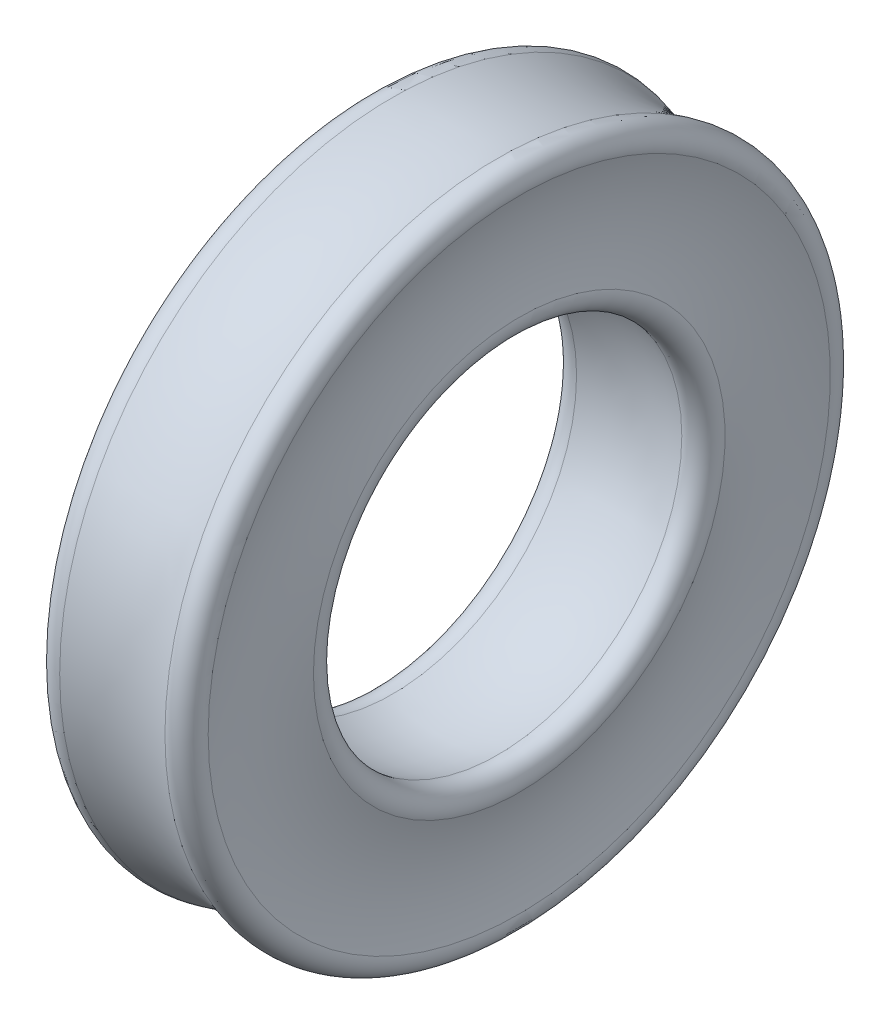
ISO-10303-21;
HEADER;
FILE_DESCRIPTION(('STEP AP214'),'2;1');
FILE_NAME('part.step','',(''),(''),'','','');
FILE_SCHEMA(('AUTOMOTIVE_DESIGN { 1 0 10303 214 1 1 1 1 }'));
ENDSEC;
DATA;
#1=APPLICATION_CONTEXT('core data for automotive mechanical design processes');
#2=APPLICATION_PROTOCOL_DEFINITION('international standard','automotive_design',2000,#1);
#3=PRODUCT_CONTEXT('',#1,'mechanical');
#4=PRODUCT('Part','Part','',(#3));
#5=PRODUCT_RELATED_PRODUCT_CATEGORY('part','',(#4));
#6=PRODUCT_DEFINITION_FORMATION('','',#4);
#7=PRODUCT_DEFINITION_CONTEXT('part definition',#1,'design');
#8=PRODUCT_DEFINITION('design','',#6,#7);
#9=PRODUCT_DEFINITION_SHAPE('','',#8);
#10=(LENGTH_UNIT() NAMED_UNIT(*) SI_UNIT(.MILLI.,.METRE.));
#11=(NAMED_UNIT(*) PLANE_ANGLE_UNIT() SI_UNIT($,.RADIAN.));
#12=(NAMED_UNIT(*) SI_UNIT($,.STERADIAN.) SOLID_ANGLE_UNIT());
#13=UNCERTAINTY_MEASURE_WITH_UNIT(LENGTH_MEASURE(1.E-05),#10,'distance_accuracy_value','');
#14=(GEOMETRIC_REPRESENTATION_CONTEXT(3) GLOBAL_UNCERTAINTY_ASSIGNED_CONTEXT((#13)) GLOBAL_UNIT_ASSIGNED_CONTEXT((#10,
#11,#12)) REPRESENTATION_CONTEXT('',''));
#15=CARTESIAN_POINT('',(0.,0.,0.));
#16=DIRECTION('',(0.,0.,1.));
#17=DIRECTION('',(1.,0.,0.));
#18=AXIS2_PLACEMENT_3D('',#15,#16,#17);
#19=CARTESIAN_POINT('',(4.15163969926534,0.,0.));
#20=DIRECTION('',(-1.,0.,0.));
#21=DIRECTION('',(0.,0.,1.));
#22=AXIS2_PLACEMENT_3D('',#19,#20,#21);
#23=TOROIDAL_SURFACE('',#22,4.51,3.);
#24=CARTESIAN_POINT('',(1.29560360902412,0.,0.));
#25=DIRECTION('',(-1.,0.,0.));
#26=DIRECTION('',(0.,0.,1.));
#27=AXIS2_PLACEMENT_3D('',#24,#25,#26);
#28=CIRCLE('',#27,5.42818181818182);
#29=CARTESIAN_POINT('',(1.29560360902412,0.,5.42818181818182));
#30=VERTEX_POINT('',#29);
#31=EDGE_CURVE('E10',#30,#30,#28,.T.);
#32=ORIENTED_EDGE('',*,*,#31,.F.);
#33=EDGE_LOOP('',(#32));
#34=FACE_BOUND('',#33,.T.);
#35=CARTESIAN_POINT('',(1.29560360902412,0.,0.));
#36=DIRECTION('',(-1.,0.,0.));
#37=DIRECTION('',(0.,0.,1.));
#38=AXIS2_PLACEMENT_3D('',#35,#36,#37);
#39=CIRCLE('',#38,3.59181818181818);
#40=CARTESIAN_POINT('',(1.29560360902412,0.,3.59181818181818));
#41=VERTEX_POINT('',#40);
#42=EDGE_CURVE('E60',#41,#41,#39,.T.);
#43=ORIENTED_EDGE('',*,*,#42,.T.);
#44=EDGE_LOOP('',(#43));
#45=FACE_BOUND('',#44,.T.);
#46=ADVANCED_FACE('F32',(#34,#45),#23,.F.);
#47=CARTESIAN_POINT('',(1.01,0.,0.));
#48=DIRECTION('',(-1.,0.,0.));
#49=DIRECTION('',(0.,0.,1.));
#50=AXIS2_PLACEMENT_3D('',#47,#48,#49);
#51=TOROIDAL_SURFACE('',#50,5.52,0.3);
#52=CARTESIAN_POINT('',(0.918181818181818,0.,0.));
#53=DIRECTION('',(-1.,0.,0.));
#54=DIRECTION('',(0.,0.,1.));
#55=AXIS2_PLACEMENT_3D('',#52,#53,#54);
#56=CIRCLE('',#55,5.80560360902412);
#57=CARTESIAN_POINT('',(0.918181818181818,0.,5.80560360902412));
#58=VERTEX_POINT('',#57);
#59=EDGE_CURVE('E38',#58,#58,#56,.T.);
#60=ORIENTED_EDGE('',*,*,#59,.F.);
#61=EDGE_LOOP('',(#60));
#62=FACE_BOUND('',#61,.T.);
#63=ORIENTED_EDGE('',*,*,#31,.T.);
#64=EDGE_LOOP('',(#63));
#65=FACE_BOUND('',#64,.T.);
#66=ADVANCED_FACE('F97',(#62,#65),#51,.T.);
#67=CARTESIAN_POINT('',(0.,0.,0.));
#68=DIRECTION('',(-1.,0.,0.));
#69=DIRECTION('',(0.,0.,1.));
#70=AXIS2_PLACEMENT_3D('',#67,#68,#69);
#71=TOROIDAL_SURFACE('',#70,8.66163969926534,3.);
#72=CARTESIAN_POINT('',(-0.918181818181818,0.,0.));
#73=DIRECTION('',(-1.,0.,0.));
#74=DIRECTION('',(0.,0.,1.));
#75=AXIS2_PLACEMENT_3D('',#72,#73,#74);
#76=CIRCLE('',#75,5.80560360902412);
#77=CARTESIAN_POINT('',(-0.918181818181818,0.,5.80560360902412));
#78=VERTEX_POINT('',#77);
#79=EDGE_CURVE('E42',#78,#78,#76,.T.);
#80=ORIENTED_EDGE('',*,*,#79,.F.);
#81=EDGE_LOOP('',(#80));
#82=FACE_BOUND('',#81,.T.);
#83=ORIENTED_EDGE('',*,*,#59,.T.);
#84=EDGE_LOOP('',(#83));
#85=FACE_BOUND('',#84,.T.);
#86=ADVANCED_FACE('F92',(#82,#85),#71,.F.);
#87=CARTESIAN_POINT('',(-1.01,0.,0.));
#88=DIRECTION('',(-1.,0.,0.));
#89=DIRECTION('',(0.,0.,1.));
#90=AXIS2_PLACEMENT_3D('',#87,#88,#89);
#91=TOROIDAL_SURFACE('',#90,5.52,0.3);
#92=CARTESIAN_POINT('',(-1.29560360902412,0.,0.));
#93=DIRECTION('',(-1.,0.,0.));
#94=DIRECTION('',(0.,0.,1.));
#95=AXIS2_PLACEMENT_3D('',#92,#93,#94);
#96=CIRCLE('',#95,5.42818181818182);
#97=CARTESIAN_POINT('',(-1.29560360902412,0.,5.42818181818182));
#98=VERTEX_POINT('',#97);
#99=EDGE_CURVE('E46',#98,#98,#96,.T.);
#100=ORIENTED_EDGE('',*,*,#99,.F.);
#101=EDGE_LOOP('',(#100));
#102=FACE_BOUND('',#101,.T.);
#103=ORIENTED_EDGE('',*,*,#79,.T.);
#104=EDGE_LOOP('',(#103));
#105=FACE_BOUND('',#104,.T.);
#106=ADVANCED_FACE('F86',(#102,#105),#91,.T.);
#107=CARTESIAN_POINT('',(-4.15163969926534,0.,0.));
#108=DIRECTION('',(-1.,0.,0.));
#109=DIRECTION('',(0.,0.,1.));
#110=AXIS2_PLACEMENT_3D('',#107,#108,#109);
#111=TOROIDAL_SURFACE('',#110,4.51,3.);
#112=CARTESIAN_POINT('',(-1.29560360902412,0.,0.));
#113=DIRECTION('',(-1.,0.,0.));
#114=DIRECTION('',(0.,0.,1.));
#115=AXIS2_PLACEMENT_3D('',#112,#113,#114);
#116=CIRCLE('',#115,3.59181818181818);
#117=CARTESIAN_POINT('',(-1.29560360902412,0.,3.59181818181818));
#118=VERTEX_POINT('',#117);
#119=EDGE_CURVE('E51',#118,#118,#116,.T.);
#120=ORIENTED_EDGE('',*,*,#119,.F.);
#121=EDGE_LOOP('',(#120));
#122=FACE_BOUND('',#121,.T.);
#123=ORIENTED_EDGE('',*,*,#99,.T.);
#124=EDGE_LOOP('',(#123));
#125=FACE_BOUND('',#124,.T.);
#126=ADVANCED_FACE('F80',(#122,#125),#111,.F.);
#127=CARTESIAN_POINT('',(-1.01,0.,0.));
#128=DIRECTION('',(-1.,0.,0.));
#129=DIRECTION('',(0.,0.,1.));
#130=AXIS2_PLACEMENT_3D('',#127,#128,#129);
#131=TOROIDAL_SURFACE('',#130,3.5,0.3);
#132=CARTESIAN_POINT('',(-0.918181818181818,0.,0.));
#133=DIRECTION('',(-1.,0.,0.));
#134=DIRECTION('',(0.,0.,1.));
#135=AXIS2_PLACEMENT_3D('',#132,#133,#134);
#136=CIRCLE('',#135,3.21439639097588);
#137=CARTESIAN_POINT('',(-0.918181818181818,0.,3.21439639097588));
#138=VERTEX_POINT('',#137);
#139=EDGE_CURVE('E54',#138,#138,#136,.T.);
#140=ORIENTED_EDGE('',*,*,#139,.F.);
#141=EDGE_LOOP('',(#140));
#142=FACE_BOUND('',#141,.T.);
#143=ORIENTED_EDGE('',*,*,#119,.T.);
#144=EDGE_LOOP('',(#143));
#145=FACE_BOUND('',#144,.T.);
#146=ADVANCED_FACE('F74',(#142,#145),#131,.T.);
#147=CARTESIAN_POINT('',(0.,0.,0.));
#148=DIRECTION('',(-1.,0.,0.));
#149=DIRECTION('',(0.,0.,1.));
#150=AXIS2_PLACEMENT_3D('',#147,#148,#149);
#151=DEGENERATE_TOROIDAL_SURFACE('',#150,0.358360300734661,3.,.T.);
#152=CARTESIAN_POINT('',(0.918181818181817,0.,0.));
#153=DIRECTION('',(-1.,0.,0.));
#154=DIRECTION('',(0.,0.,1.));
#155=AXIS2_PLACEMENT_3D('',#152,#153,#154);
#156=CIRCLE('',#155,3.21439639097588);
#157=CARTESIAN_POINT('',(0.918181818181817,0.,3.21439639097588));
#158=VERTEX_POINT('',#157);
#159=EDGE_CURVE('E57',#158,#158,#156,.T.);
#160=ORIENTED_EDGE('',*,*,#159,.F.);
#161=EDGE_LOOP('',(#160));
#162=FACE_BOUND('',#161,.T.);
#163=ORIENTED_EDGE('',*,*,#139,.T.);
#164=EDGE_LOOP('',(#163));
#165=FACE_BOUND('',#164,.T.);
#166=ADVANCED_FACE('F68',(#162,#165),#151,.F.);
#167=CARTESIAN_POINT('',(1.01,0.,0.));
#168=DIRECTION('',(-1.,0.,0.));
#169=DIRECTION('',(0.,0.,1.));
#170=AXIS2_PLACEMENT_3D('',#167,#168,#169);
#171=TOROIDAL_SURFACE('',#170,3.5,0.3);
#172=ORIENTED_EDGE('',*,*,#42,.F.);
#173=EDGE_LOOP('',(#172));
#174=FACE_BOUND('',#173,.T.);
#175=ORIENTED_EDGE('',*,*,#159,.T.);
#176=EDGE_LOOP('',(#175));
#177=FACE_BOUND('',#176,.T.);
#178=ADVANCED_FACE('F65',(#174,#177),#171,.T.);
#179=CLOSED_SHELL('',(#46,#66,#86,#106,#126,#146,#166,#178));
#180=MANIFOLD_SOLID_BREP('B2',#179);
#181=ADVANCED_BREP_SHAPE_REPRESENTATION('',(#18,#180),#14);
#182=SHAPE_DEFINITION_REPRESENTATION(#9,#181);
ENDSEC;
END-ISO-10303-21;
